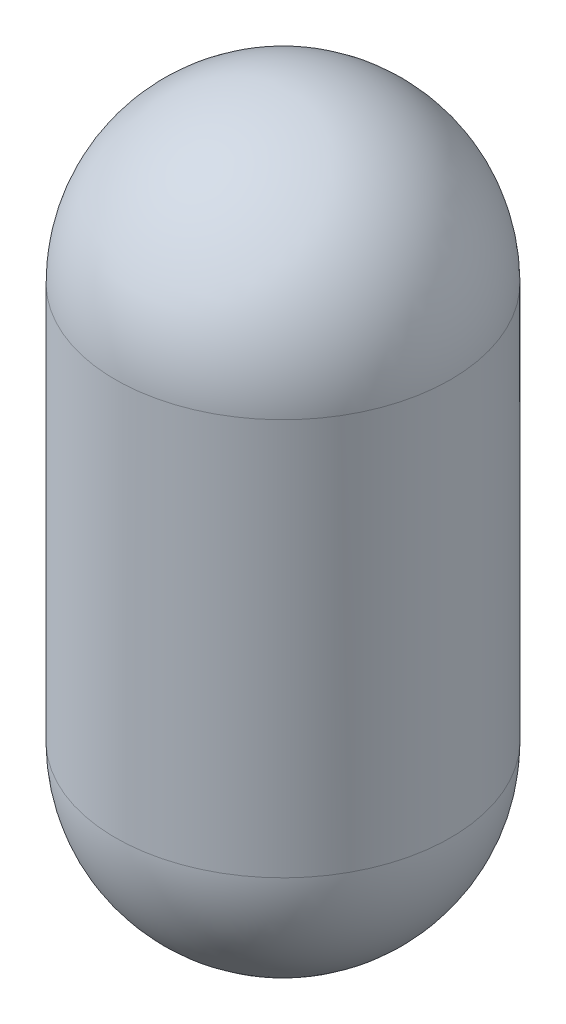
ISO-10303-21;
HEADER;
FILE_DESCRIPTION(('STEP AP214'),'2;1');
FILE_NAME('part.step','',(''),(''),'','','');
FILE_SCHEMA(('AUTOMOTIVE_DESIGN { 1 0 10303 214 1 1 1 1 }'));
ENDSEC;
DATA;
#1=APPLICATION_CONTEXT('core data for automotive mechanical design processes');
#2=APPLICATION_PROTOCOL_DEFINITION('international standard','automotive_design',2000,#1);
#3=PRODUCT_CONTEXT('',#1,'mechanical');
#4=PRODUCT('Part','Part','',(#3));
#5=PRODUCT_RELATED_PRODUCT_CATEGORY('part','',(#4));
#6=PRODUCT_DEFINITION_FORMATION('','',#4);
#7=PRODUCT_DEFINITION_CONTEXT('part definition',#1,'design');
#8=PRODUCT_DEFINITION('design','',#6,#7);
#9=PRODUCT_DEFINITION_SHAPE('','',#8);
#10=(LENGTH_UNIT() NAMED_UNIT(*) SI_UNIT(.MILLI.,.METRE.));
#11=(NAMED_UNIT(*) PLANE_ANGLE_UNIT() SI_UNIT($,.RADIAN.));
#12=(NAMED_UNIT(*) SI_UNIT($,.STERADIAN.) SOLID_ANGLE_UNIT());
#13=UNCERTAINTY_MEASURE_WITH_UNIT(LENGTH_MEASURE(1.E-05),#10,'distance_accuracy_value','');
#14=(GEOMETRIC_REPRESENTATION_CONTEXT(3) GLOBAL_UNCERTAINTY_ASSIGNED_CONTEXT((#13)) GLOBAL_UNIT_ASSIGNED_CONTEXT((#10,
#11,#12)) REPRESENTATION_CONTEXT('',''));
#15=CARTESIAN_POINT('',(0.,0.,0.));
#16=DIRECTION('',(0.,0.,1.));
#17=DIRECTION('',(1.,0.,0.));
#18=AXIS2_PLACEMENT_3D('',#15,#16,#17);
#19=CARTESIAN_POINT('',(0.,43.97375,0.));
#20=DIRECTION('',(0.,1.,0.));
#21=DIRECTION('',(1.,0.,0.));
#22=AXIS2_PLACEMENT_3D('',#19,#20,#21);
#23=SPHERICAL_SURFACE('',#22,37.1475);
#24=CARTESIAN_POINT('',(0.,43.97375,0.));
#25=DIRECTION('',(0.,1.,0.));
#26=DIRECTION('',(-1.,0.,0.));
#27=AXIS2_PLACEMENT_3D('',#24,#25,#26);
#28=CIRCLE('',#27,37.1475);
#29=CARTESIAN_POINT('',(-37.1475,43.97375,0.));
#30=VERTEX_POINT('',#29);
#31=EDGE_CURVE('E10',#30,#30,#28,.T.);
#32=ORIENTED_EDGE('',*,*,#31,.T.);
#33=EDGE_LOOP('',(#32));
#34=FACE_BOUND('',#33,.T.);
#35=ADVANCED_FACE('F38',(#34),#23,.T.);
#36=CARTESIAN_POINT('',(0.,43.97375,0.));
#37=DIRECTION('',(0.,1.,0.));
#38=DIRECTION('',(-1.,0.,0.));
#39=AXIS2_PLACEMENT_3D('',#36,#37,#38);
#40=CYLINDRICAL_SURFACE('',#39,37.1475);
#41=CARTESIAN_POINT('',(0.,-43.97375,0.));
#42=DIRECTION('',(0.,1.,0.));
#43=DIRECTION('',(-1.,0.,0.));
#44=AXIS2_PLACEMENT_3D('',#41,#42,#43);
#45=CIRCLE('',#44,37.1475);
#46=CARTESIAN_POINT('',(-37.1475000000001,-43.97375,0.));
#47=VERTEX_POINT('',#46);
#48=EDGE_CURVE('E46',#47,#47,#45,.T.);
#49=ORIENTED_EDGE('',*,*,#48,.T.);
#50=EDGE_LOOP('',(#49));
#51=FACE_BOUND('',#50,.T.);
#52=ORIENTED_EDGE('',*,*,#31,.F.);
#53=EDGE_LOOP('',(#52));
#54=FACE_BOUND('',#53,.T.);
#55=ADVANCED_FACE('F83',(#51,#54),#40,.T.);
#56=CARTESIAN_POINT('',(0.,-43.97375,0.));
#57=DIRECTION('',(0.,1.,0.));
#58=DIRECTION('',(-1.,0.,0.));
#59=AXIS2_PLACEMENT_3D('',#56,#57,#58);
#60=SPHERICAL_SURFACE('',#59,37.1475);
#61=ORIENTED_EDGE('',*,*,#48,.F.);
#62=EDGE_LOOP('',(#61));
#63=FACE_BOUND('',#62,.T.);
#64=ADVANCED_FACE('F82',(#63),#60,.T.);
#65=CLOSED_SHELL('',(#35,#55,#64));
#66=CARTESIAN_POINT('',(0.,-43.97375,0.));
#67=DIRECTION('',(0.,1.,0.));
#68=DIRECTION('',(1.,0.,0.));
#69=AXIS2_PLACEMENT_3D('',#66,#67,#68);
#70=SPHERICAL_SURFACE('',#69,35.56);
#71=CARTESIAN_POINT('',(0.,-43.97375,0.));
#72=DIRECTION('',(0.,1.,0.));
#73=DIRECTION('',(-1.,0.,0.));
#74=AXIS2_PLACEMENT_3D('',#71,#72,#73);
#75=CIRCLE('',#74,35.56);
#76=CARTESIAN_POINT('',(-35.56,-43.97375,0.));
#77=VERTEX_POINT('',#76);
#78=EDGE_CURVE('E51',#77,#77,#75,.T.);
#79=ORIENTED_EDGE('',*,*,#78,.T.);
#80=EDGE_LOOP('',(#79));
#81=FACE_BOUND('',#80,.T.);
#82=ADVANCED_FACE('F73',(#81),#70,.F.);
#83=CARTESIAN_POINT('',(0.,43.97375,0.));
#84=DIRECTION('',(0.,1.,0.));
#85=DIRECTION('',(-1.,0.,0.));
#86=AXIS2_PLACEMENT_3D('',#83,#84,#85);
#87=CYLINDRICAL_SURFACE('',#86,35.56);
#88=CARTESIAN_POINT('',(0.,43.97375,0.));
#89=DIRECTION('',(0.,1.,0.));
#90=DIRECTION('',(-1.,0.,0.));
#91=AXIS2_PLACEMENT_3D('',#88,#89,#90);
#92=CIRCLE('',#91,35.56);
#93=CARTESIAN_POINT('',(-35.56,43.97375,0.));
#94=VERTEX_POINT('',#93);
#95=EDGE_CURVE('E56',#94,#94,#92,.T.);
#96=ORIENTED_EDGE('',*,*,#95,.T.);
#97=EDGE_LOOP('',(#96));
#98=FACE_BOUND('',#97,.T.);
#99=ORIENTED_EDGE('',*,*,#78,.F.);
#100=EDGE_LOOP('',(#99));
#101=FACE_BOUND('',#100,.T.);
#102=ADVANCED_FACE('F63',(#98,#101),#87,.F.);
#103=CARTESIAN_POINT('',(0.,43.97375,0.));
#104=DIRECTION('',(0.,1.,0.));
#105=DIRECTION('',(-1.,0.,0.));
#106=AXIS2_PLACEMENT_3D('',#103,#104,#105);
#107=SPHERICAL_SURFACE('',#106,35.56);
#108=ORIENTED_EDGE('',*,*,#95,.F.);
#109=EDGE_LOOP('',(#108));
#110=FACE_BOUND('',#109,.T.);
#111=ADVANCED_FACE('F66',(#110),#107,.F.);
#112=CLOSED_SHELL('',(#82,#102,#111));
#113=ORIENTED_CLOSED_SHELL('',*,#112,.T.);
#114=BREP_WITH_VOIDS('B2',#65,(#113));
#115=ADVANCED_BREP_SHAPE_REPRESENTATION('',(#18,#114),#14);
#116=SHAPE_DEFINITION_REPRESENTATION(#9,#115);
ENDSEC;
END-ISO-10303-21;
